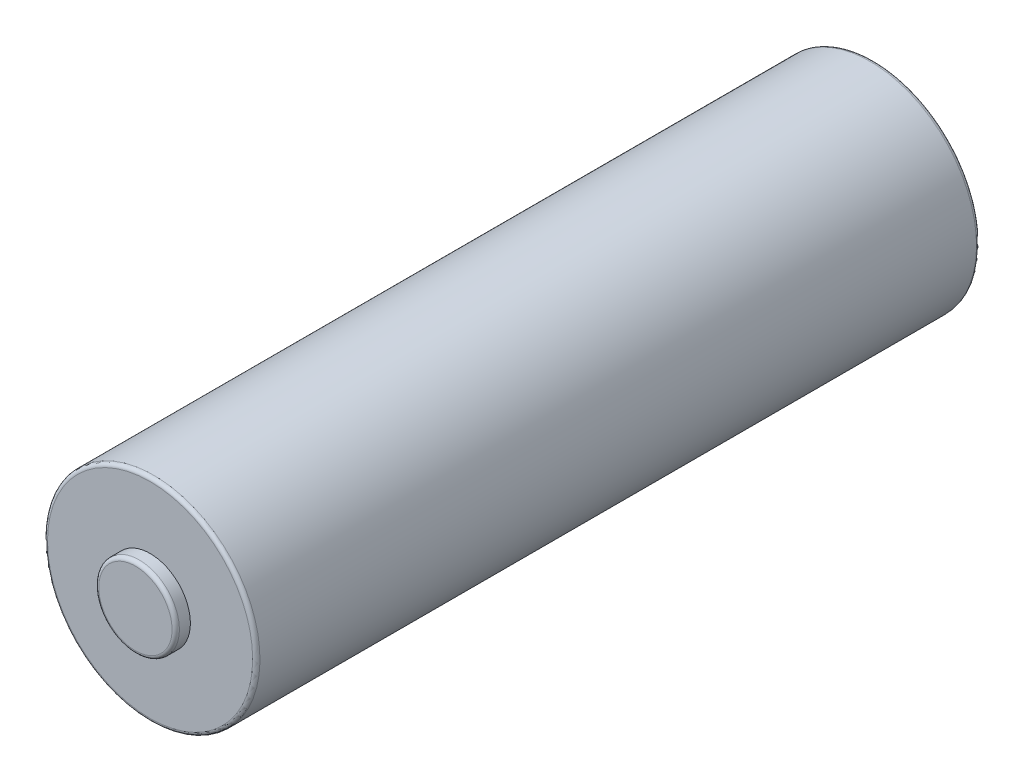
ISO-10303-21;
HEADER;
FILE_DESCRIPTION(('STEP AP214'),'2;1');
FILE_NAME('part.step','',(''),(''),'','','');
FILE_SCHEMA(('AUTOMOTIVE_DESIGN { 1 0 10303 214 1 1 1 1 }'));
ENDSEC;
DATA;
#1=APPLICATION_CONTEXT('core data for automotive mechanical design processes');
#2=APPLICATION_PROTOCOL_DEFINITION('international standard','automotive_design',2000,#1);
#3=PRODUCT_CONTEXT('',#1,'mechanical');
#4=PRODUCT('Part','Part','',(#3));
#5=PRODUCT_RELATED_PRODUCT_CATEGORY('part','',(#4));
#6=PRODUCT_DEFINITION_FORMATION('','',#4);
#7=PRODUCT_DEFINITION_CONTEXT('part definition',#1,'design');
#8=PRODUCT_DEFINITION('design','',#6,#7);
#9=PRODUCT_DEFINITION_SHAPE('','',#8);
#10=(LENGTH_UNIT() NAMED_UNIT(*) SI_UNIT(.MILLI.,.METRE.));
#11=(NAMED_UNIT(*) PLANE_ANGLE_UNIT() SI_UNIT($,.RADIAN.));
#12=(NAMED_UNIT(*) SI_UNIT($,.STERADIAN.) SOLID_ANGLE_UNIT());
#13=UNCERTAINTY_MEASURE_WITH_UNIT(LENGTH_MEASURE(1.E-05),#10,'distance_accuracy_value','');
#14=(GEOMETRIC_REPRESENTATION_CONTEXT(3) GLOBAL_UNCERTAINTY_ASSIGNED_CONTEXT((#13)) GLOBAL_UNIT_ASSIGNED_CONTEXT((#10,
#11,#12)) REPRESENTATION_CONTEXT('',''));
#15=CARTESIAN_POINT('',(0.,0.,0.));
#16=DIRECTION('',(0.,0.,1.));
#17=DIRECTION('',(1.,0.,0.));
#18=AXIS2_PLACEMENT_3D('',#15,#16,#17);
#19=CARTESIAN_POINT('',(0.,0.,42.153036437247));
#20=DIRECTION('',(0.,0.,-1.));
#21=DIRECTION('',(-1.,0.,0.));
#22=AXIS2_PLACEMENT_3D('',#19,#20,#21);
#23=CYLINDRICAL_SURFACE('',#22,4.25101214574899);
#24=CARTESIAN_POINT('',(0.,0.,42.085020242915));
#25=DIRECTION('',(0.,0.,-1.));
#26=DIRECTION('',(-1.,0.,0.));
#27=AXIS2_PLACEMENT_3D('',#24,#25,#26);
#28=CIRCLE('',#27,4.25101214574899);
#29=CARTESIAN_POINT('',(-4.25101214574899,0.,42.085020242915));
#30=VERTEX_POINT('',#29);
#31=EDGE_CURVE('P0_E10',#30,#30,#28,.T.);
#32=ORIENTED_EDGE('',*,*,#31,.T.);
#33=EDGE_LOOP('',(#32));
#34=FACE_BOUND('',#33,.T.);
#35=CARTESIAN_POINT('',(0.,0.,42.153036437247));
#36=DIRECTION('',(0.,0.,-1.));
#37=DIRECTION('',(-1.,0.,0.));
#38=AXIS2_PLACEMENT_3D('',#35,#36,#37);
#39=CIRCLE('',#38,4.25101214574899);
#40=CARTESIAN_POINT('',(-4.25101214574899,0.,42.153036437247));
#41=VERTEX_POINT('',#40);
#42=EDGE_CURVE('P0_E81',#41,#41,#39,.T.);
#43=ORIENTED_EDGE('',*,*,#42,.F.);
#44=EDGE_LOOP('',(#43));
#45=FACE_BOUND('',#44,.T.);
#46=ADVANCED_FACE('P0_F47',(#34,#45),#23,.F.);
#47=CARTESIAN_POINT('',(4.25101214574899,0.,42.085020242915));
#48=DIRECTION('',(0.,0.,-1.));
#49=DIRECTION('',(-1.,0.,0.));
#50=AXIS2_PLACEMENT_3D('',#47,#48,#49);
#51=PLANE('',#50);
#52=CARTESIAN_POINT('',(0.,0.,42.085020242915));
#53=DIRECTION('',(0.,0.,-1.));
#54=DIRECTION('',(-1.,0.,0.));
#55=AXIS2_PLACEMENT_3D('',#52,#53,#54);
#56=CIRCLE('',#55,6.16396761133603);
#57=CARTESIAN_POINT('',(-6.16396761133603,0.,42.085020242915));
#58=VERTEX_POINT('',#57);
#59=EDGE_CURVE('P0_E53',#58,#58,#56,.T.);
#60=ORIENTED_EDGE('',*,*,#59,.T.);
#61=EDGE_LOOP('',(#60));
#62=FACE_BOUND('',#61,.T.);
#63=ORIENTED_EDGE('',*,*,#31,.F.);
#64=EDGE_LOOP('',(#63));
#65=FACE_BOUND('',#64,.T.);
#66=ADVANCED_FACE('P0_F89',(#62,#65),#51,.T.);
#67=CARTESIAN_POINT('',(0.,0.,42.153036437247));
#68=DIRECTION('',(0.,0.,-1.));
#69=DIRECTION('',(-1.,0.,0.));
#70=AXIS2_PLACEMENT_3D('',#67,#68,#69);
#71=CYLINDRICAL_SURFACE('',#70,6.16396761133603);
#72=CARTESIAN_POINT('',(0.,0.,0.085020242914978));
#73=DIRECTION('',(0.,0.,-1.));
#74=DIRECTION('',(-1.,0.,0.));
#75=AXIS2_PLACEMENT_3D('',#72,#73,#74);
#76=CIRCLE('',#75,6.16396761133603);
#77=CARTESIAN_POINT('',(-6.16396761133603,0.,0.085020242914978));
#78=VERTEX_POINT('',#77);
#79=EDGE_CURVE('P0_E57',#78,#78,#76,.T.);
#80=ORIENTED_EDGE('',*,*,#79,.T.);
#81=EDGE_LOOP('',(#80));
#82=FACE_BOUND('',#81,.T.);
#83=ORIENTED_EDGE('',*,*,#59,.F.);
#84=EDGE_LOOP('',(#83));
#85=FACE_BOUND('',#84,.T.);
#86=ADVANCED_FACE('P0_F93',(#82,#85),#71,.F.);
#87=CARTESIAN_POINT('',(6.16396761133603,0.,0.0850202429149802));
#88=DIRECTION('',(0.,0.,1.));
#89=DIRECTION('',(1.,0.,0.));
#90=AXIS2_PLACEMENT_3D('',#87,#88,#89);
#91=PLANE('',#90);
#92=CARTESIAN_POINT('',(0.,0.,0.085020242914978));
#93=DIRECTION('',(0.,0.,-1.));
#94=DIRECTION('',(-1.,0.,0.));
#95=AXIS2_PLACEMENT_3D('',#92,#93,#94);
#96=CIRCLE('',#95,4.25101214574899);
#97=CARTESIAN_POINT('',(-4.25101214574899,0.,0.085020242914978));
#98=VERTEX_POINT('',#97);
#99=EDGE_CURVE('P0_E61',#98,#98,#96,.T.);
#100=ORIENTED_EDGE('',*,*,#99,.T.);
#101=EDGE_LOOP('',(#100));
#102=FACE_BOUND('',#101,.T.);
#103=ORIENTED_EDGE('',*,*,#79,.F.);
#104=EDGE_LOOP('',(#103));
#105=FACE_BOUND('',#104,.T.);
#106=ADVANCED_FACE('P0_F97',(#102,#105),#91,.T.);
#107=CARTESIAN_POINT('',(0.,0.,42.153036437247));
#108=DIRECTION('',(0.,0.,-1.));
#109=DIRECTION('',(-1.,0.,0.));
#110=AXIS2_PLACEMENT_3D('',#107,#108,#109);
#111=CYLINDRICAL_SURFACE('',#110,4.25101214574899);
#112=CARTESIAN_POINT('',(0.,0.,0.0170040485829928));
#113=DIRECTION('',(0.,0.,-1.));
#114=DIRECTION('',(-1.,0.,0.));
#115=AXIS2_PLACEMENT_3D('',#112,#113,#114);
#116=CIRCLE('',#115,4.25101214574899);
#117=CARTESIAN_POINT('',(-4.25101214574899,0.,0.0170040485829928));
#118=VERTEX_POINT('',#117);
#119=EDGE_CURVE('P0_E66',#118,#118,#116,.T.);
#120=ORIENTED_EDGE('',*,*,#119,.T.);
#121=EDGE_LOOP('',(#120));
#122=FACE_BOUND('',#121,.T.);
#123=ORIENTED_EDGE('',*,*,#99,.F.);
#124=EDGE_LOOP('',(#123));
#125=FACE_BOUND('',#124,.T.);
#126=ADVANCED_FACE('P0_F104',(#122,#125),#111,.F.);
#127=CARTESIAN_POINT('',(4.25101214574899,0.,0.017004048582996));
#128=DIRECTION('',(0.,0.,-1.));
#129=DIRECTION('',(-1.,0.,0.));
#130=AXIS2_PLACEMENT_3D('',#127,#128,#129);
#131=PLANE('',#130);
#132=CARTESIAN_POINT('',(0.,0.,0.0170040485829928));
#133=DIRECTION('',(0.,0.,-1.));
#134=DIRECTION('',(-1.,0.,0.));
#135=AXIS2_PLACEMENT_3D('',#132,#133,#134);
#136=CIRCLE('',#135,6.06194331983806);
#137=CARTESIAN_POINT('',(-6.06194331983806,0.,0.0170040485829928));
#138=VERTEX_POINT('',#137);
#139=EDGE_CURVE('P0_E69',#138,#138,#136,.T.);
#140=ORIENTED_EDGE('',*,*,#139,.T.);
#141=EDGE_LOOP('',(#140));
#142=FACE_BOUND('',#141,.T.);
#143=ORIENTED_EDGE('',*,*,#119,.F.);
#144=EDGE_LOOP('',(#143));
#145=FACE_BOUND('',#144,.T.);
#146=ADVANCED_FACE('P0_F108',(#142,#145),#131,.T.);
#147=CARTESIAN_POINT('',(0.,0.,0.187044534412955));
#148=DIRECTION('',(0.,0.,-1.));
#149=DIRECTION('',(-1.,0.,0.));
#150=AXIS2_PLACEMENT_3D('',#147,#148,#149);
#151=TOROIDAL_SURFACE('',#150,6.06194331983806,0.170040485829959);
#152=CARTESIAN_POINT('',(0.,0.,0.187044534412956));
#153=DIRECTION('',(0.,0.,-1.));
#154=DIRECTION('',(-1.,0.,0.));
#155=AXIS2_PLACEMENT_3D('',#152,#153,#154);
#156=CIRCLE('',#155,6.23198380566802);
#157=CARTESIAN_POINT('',(-6.23198380566802,0.,0.187044534412956));
#158=VERTEX_POINT('',#157);
#159=EDGE_CURVE('P0_E72',#158,#158,#156,.T.);
#160=ORIENTED_EDGE('',*,*,#159,.T.);
#161=EDGE_LOOP('',(#160));
#162=FACE_BOUND('',#161,.T.);
#163=ORIENTED_EDGE('',*,*,#139,.F.);
#164=EDGE_LOOP('',(#163));
#165=FACE_BOUND('',#164,.T.);
#166=ADVANCED_FACE('P0_F112',(#162,#165),#151,.T.);
#167=CARTESIAN_POINT('',(0.,0.,42.153036437247));
#168=DIRECTION('',(0.,0.,-1.));
#169=DIRECTION('',(-1.,0.,0.));
#170=AXIS2_PLACEMENT_3D('',#167,#168,#169);
#171=CYLINDRICAL_SURFACE('',#170,6.23198380566802);
#172=CARTESIAN_POINT('',(0.,0.,41.982995951417));
#173=DIRECTION('',(0.,0.,-1.));
#174=DIRECTION('',(-1.,0.,0.));
#175=AXIS2_PLACEMENT_3D('',#172,#173,#174);
#176=CIRCLE('',#175,6.23198380566802);
#177=CARTESIAN_POINT('',(-6.23198380566802,0.,41.982995951417));
#178=VERTEX_POINT('',#177);
#179=EDGE_CURVE('P0_E75',#178,#178,#176,.T.);
#180=ORIENTED_EDGE('',*,*,#179,.T.);
#181=EDGE_LOOP('',(#180));
#182=FACE_BOUND('',#181,.T.);
#183=ORIENTED_EDGE('',*,*,#159,.F.);
#184=EDGE_LOOP('',(#183));
#185=FACE_BOUND('',#184,.T.);
#186=ADVANCED_FACE('P0_F116',(#182,#185),#171,.T.);
#187=CARTESIAN_POINT('',(0.,0.,41.982995951417));
#188=DIRECTION('',(0.,0.,-1.));
#189=DIRECTION('',(-1.,0.,0.));
#190=AXIS2_PLACEMENT_3D('',#187,#188,#189);
#191=TOROIDAL_SURFACE('',#190,6.06194331983806,0.170040485829961);
#192=CARTESIAN_POINT('',(0.,0.,42.153036437247));
#193=DIRECTION('',(0.,0.,-1.));
#194=DIRECTION('',(-1.,0.,0.));
#195=AXIS2_PLACEMENT_3D('',#192,#193,#194);
#196=CIRCLE('',#195,6.06194331983806);
#197=CARTESIAN_POINT('',(-6.06194331983806,0.,42.153036437247));
#198=VERTEX_POINT('',#197);
#199=EDGE_CURVE('P0_E78',#198,#198,#196,.T.);
#200=ORIENTED_EDGE('',*,*,#199,.T.);
#201=EDGE_LOOP('',(#200));
#202=FACE_BOUND('',#201,.T.);
#203=ORIENTED_EDGE('',*,*,#179,.F.);
#204=EDGE_LOOP('',(#203));
#205=FACE_BOUND('',#204,.T.);
#206=ADVANCED_FACE('P0_F120',(#202,#205),#191,.T.);
#207=CARTESIAN_POINT('',(6.06194331983806,0.,42.153036437247));
#208=DIRECTION('',(0.,0.,1.));
#209=DIRECTION('',(1.,0.,0.));
#210=AXIS2_PLACEMENT_3D('',#207,#208,#209);
#211=PLANE('',#210);
#212=ORIENTED_EDGE('',*,*,#42,.T.);
#213=EDGE_LOOP('',(#212));
#214=FACE_BOUND('',#213,.T.);
#215=ORIENTED_EDGE('',*,*,#199,.F.);
#216=EDGE_LOOP('',(#215));
#217=FACE_BOUND('',#216,.T.);
#218=ADVANCED_FACE('P0_F85',(#214,#217),#211,.T.);
#219=CLOSED_SHELL('',(#46,#66,#86,#106,#126,#146,#166,#186,#206,#218));
#220=MANIFOLD_SOLID_BREP('P0_B2',#219);
#221=CARTESIAN_POINT('',(0.,0.,50.5));
#222=DIRECTION('',(0.,0.,-1.));
#223=DIRECTION('',(0.,-1.,0.));
#224=AXIS2_PLACEMENT_3D('',#221,#222,#223);
#225=PLANE('',#224);
#226=CARTESIAN_POINT('',(0.,0.,50.5));
#227=DIRECTION('',(0.,0.,1.));
#228=DIRECTION('',(0.,-1.,0.));
#229=AXIS2_PLACEMENT_3D('',#226,#227,#228);
#230=CIRCLE('',#229,2.5);
#231=CARTESIAN_POINT('',(0.,-2.5,50.5));
#232=VERTEX_POINT('',#231);
#233=EDGE_CURVE('P1_E11',#232,#232,#230,.T.);
#234=ORIENTED_EDGE('',*,*,#233,.T.);
#235=EDGE_LOOP('',(#234));
#236=FACE_BOUND('',#235,.T.);
#237=ADVANCED_FACE('P1_F19',(#236),#225,.F.);
#238=CARTESIAN_POINT('',(0.,3.,0.));
#239=DIRECTION('',(0.,0.,1.));
#240=DIRECTION('',(1.,0.,0.));
#241=AXIS2_PLACEMENT_3D('',#238,#239,#240);
#242=PLANE('',#241);
#243=CARTESIAN_POINT('',(0.,0.,0.));
#244=DIRECTION('',(0.,0.,1.));
#245=DIRECTION('',(0.,-1.,0.));
#246=AXIS2_PLACEMENT_3D('',#243,#244,#245);
#247=CIRCLE('',#246,3.);
#248=CARTESIAN_POINT('',(0.,-3.,0.));
#249=VERTEX_POINT('',#248);
#250=EDGE_CURVE('P1_E78',#249,#249,#247,.T.);
#251=ORIENTED_EDGE('',*,*,#250,.F.);
#252=EDGE_LOOP('',(#251));
#253=FACE_BOUND('',#252,.T.);
#254=ADVANCED_FACE('P1_F21',(#253),#242,.F.);
#255=CARTESIAN_POINT('',(0.,2.75,49.5));
#256=DIRECTION('',(0.,0.,-1.));
#257=DIRECTION('',(0.,-1.,0.));
#258=AXIS2_PLACEMENT_3D('',#255,#256,#257);
#259=PLANE('',#258);
#260=CARTESIAN_POINT('',(0.,0.,49.5));
#261=DIRECTION('',(0.,0.,1.));
#262=DIRECTION('',(0.,-1.,0.));
#263=AXIS2_PLACEMENT_3D('',#260,#261,#262);
#264=CIRCLE('',#263,2.75);
#265=CARTESIAN_POINT('',(0.,-2.75,49.5));
#266=VERTEX_POINT('',#265);
#267=EDGE_CURVE('P1_E115',#266,#266,#264,.T.);
#268=ORIENTED_EDGE('',*,*,#267,.F.);
#269=EDGE_LOOP('',(#268));
#270=FACE_BOUND('',#269,.T.);
#271=CARTESIAN_POINT('',(0.,0.,49.5));
#272=DIRECTION('',(0.,0.,1.));
#273=DIRECTION('',(0.,-1.,0.));
#274=AXIS2_PLACEMENT_3D('',#271,#272,#273);
#275=CIRCLE('',#274,7.);
#276=CARTESIAN_POINT('',(0.,-7.,49.5));
#277=VERTEX_POINT('',#276);
#278=EDGE_CURVE('P1_E104',#277,#277,#275,.T.);
#279=ORIENTED_EDGE('',*,*,#278,.T.);
#280=EDGE_LOOP('',(#279));
#281=FACE_BOUND('',#280,.T.);
#282=ADVANCED_FACE('P1_F149',(#270,#281),#259,.F.);
#283=CARTESIAN_POINT('',(0.,7.,0.1));
#284=DIRECTION('',(0.,0.,1.));
#285=DIRECTION('',(1.,0.,0.));
#286=AXIS2_PLACEMENT_3D('',#283,#284,#285);
#287=PLANE('',#286);
#288=CARTESIAN_POINT('',(0.,0.,0.1));
#289=DIRECTION('',(0.,0.,1.));
#290=DIRECTION('',(0.,-1.,0.));
#291=AXIS2_PLACEMENT_3D('',#288,#289,#290);
#292=CIRCLE('',#291,3.5);
#293=CARTESIAN_POINT('',(0.,-3.5,0.1));
#294=VERTEX_POINT('',#293);
#295=EDGE_CURVE('P1_E70',#294,#294,#292,.T.);
#296=ORIENTED_EDGE('',*,*,#295,.T.);
#297=EDGE_LOOP('',(#296));
#298=FACE_BOUND('',#297,.T.);
#299=CARTESIAN_POINT('',(0.,0.,0.1));
#300=DIRECTION('',(0.,0.,1.));
#301=DIRECTION('',(0.,-1.,0.));
#302=AXIS2_PLACEMENT_3D('',#299,#300,#301);
#303=CIRCLE('',#302,7.);
#304=CARTESIAN_POINT('',(0.,-7.,0.1));
#305=VERTEX_POINT('',#304);
#306=EDGE_CURVE('P1_E85',#305,#305,#303,.T.);
#307=ORIENTED_EDGE('',*,*,#306,.F.);
#308=EDGE_LOOP('',(#307));
#309=FACE_BOUND('',#308,.T.);
#310=ADVANCED_FACE('P1_F71',(#298,#309),#287,.F.);
#311=CARTESIAN_POINT('',(0.,0.,50.25));
#312=DIRECTION('',(0.,0.,1.));
#313=DIRECTION('',(0.,-1.,0.));
#314=AXIS2_PLACEMENT_3D('',#311,#312,#313);
#315=TOROIDAL_SURFACE('',#314,2.5,0.25);
#316=CARTESIAN_POINT('',(0.,-2.5,50.25));
#317=DIRECTION('',(1.,0.,0.));
#318=DIRECTION('',(0.,-1.,0.));
#319=AXIS2_PLACEMENT_3D('',#316,#317,#318);
#320=CIRCLE('',#319,0.25);
#321=CARTESIAN_POINT('',(0.,-2.75,50.25));
#322=VERTEX_POINT('',#321);
#323=EDGE_CURVE('P1_E30',#232,#322,#320,.T.);
#324=ORIENTED_EDGE('',*,*,#323,.T.);
#325=CARTESIAN_POINT('',(0.,0.,50.25));
#326=DIRECTION('',(0.,0.,1.));
#327=DIRECTION('',(0.,-1.,0.));
#328=AXIS2_PLACEMENT_3D('',#325,#326,#327);
#329=CIRCLE('',#328,2.75);
#330=EDGE_CURVE('P1_E183',#322,#322,#329,.T.);
#331=ORIENTED_EDGE('',*,*,#330,.T.);
#332=ORIENTED_EDGE('',*,*,#323,.F.);
#333=ORIENTED_EDGE('',*,*,#233,.F.);
#334=EDGE_LOOP('',(#324,#331,#332,#333));
#335=FACE_BOUND('',#334,.T.);
#336=ADVANCED_FACE('P1_F148',(#335),#315,.T.);
#337=CARTESIAN_POINT('',(0.,0.,0.));
#338=DIRECTION('',(0.,0.,1.));
#339=DIRECTION('',(0.,-1.,0.));
#340=AXIS2_PLACEMENT_3D('',#337,#338,#339);
#341=CYLINDRICAL_SURFACE('',#340,2.75);
#342=DIRECTION('',(0.,0.,-1.));
#343=VECTOR('',#342,1.);
#344=CARTESIAN_POINT('',(0.,-2.75,50.25));
#345=LINE('',#344,#343);
#346=EDGE_CURVE('P1_E109',#322,#266,#345,.T.);
#347=ORIENTED_EDGE('',*,*,#346,.T.);
#348=ORIENTED_EDGE('',*,*,#267,.T.);
#349=ORIENTED_EDGE('',*,*,#346,.F.);
#350=ORIENTED_EDGE('',*,*,#330,.F.);
#351=EDGE_LOOP('',(#347,#348,#349,#350));
#352=FACE_BOUND('',#351,.T.);
#353=ADVANCED_FACE('P1_F154',(#352),#341,.T.);
#354=CARTESIAN_POINT('',(0.,0.,49.25));
#355=DIRECTION('',(0.,0.,1.));
#356=DIRECTION('',(0.,-1.,0.));
#357=AXIS2_PLACEMENT_3D('',#354,#355,#356);
#358=TOROIDAL_SURFACE('',#357,7.,0.25);
#359=CARTESIAN_POINT('',(0.,-7.,49.25));
#360=DIRECTION('',(1.,0.,0.));
#361=DIRECTION('',(0.,-1.,0.));
#362=AXIS2_PLACEMENT_3D('',#359,#360,#361);
#363=CIRCLE('',#362,0.25);
#364=CARTESIAN_POINT('',(0.,-7.25,49.25));
#365=VERTEX_POINT('',#364);
#366=EDGE_CURVE('P1_E91',#277,#365,#363,.T.);
#367=ORIENTED_EDGE('',*,*,#366,.T.);
#368=CARTESIAN_POINT('',(0.,0.,49.25));
#369=DIRECTION('',(0.,0.,1.));
#370=DIRECTION('',(0.,-1.,0.));
#371=AXIS2_PLACEMENT_3D('',#368,#369,#370);
#372=CIRCLE('',#371,7.25);
#373=EDGE_CURVE('P1_E126',#365,#365,#372,.T.);
#374=ORIENTED_EDGE('',*,*,#373,.T.);
#375=ORIENTED_EDGE('',*,*,#366,.F.);
#376=ORIENTED_EDGE('',*,*,#278,.F.);
#377=EDGE_LOOP('',(#367,#374,#375,#376));
#378=FACE_BOUND('',#377,.T.);
#379=ADVANCED_FACE('P1_F172',(#378),#358,.T.);
#380=CARTESIAN_POINT('',(0.,0.,0.));
#381=DIRECTION('',(0.,0.,1.));
#382=DIRECTION('',(0.,-1.,0.));
#383=AXIS2_PLACEMENT_3D('',#380,#381,#382);
#384=CYLINDRICAL_SURFACE('',#383,7.25);
#385=DIRECTION('',(0.,0.,-1.));
#386=VECTOR('',#385,1.);
#387=CARTESIAN_POINT('',(0.,-7.25,49.25));
#388=LINE('',#387,#386);
#389=CARTESIAN_POINT('',(0.,-7.25,0.35));
#390=VERTEX_POINT('',#389);
#391=EDGE_CURVE('P1_E110',#365,#390,#388,.T.);
#392=ORIENTED_EDGE('',*,*,#391,.T.);
#393=CARTESIAN_POINT('',(0.,0.,0.35));
#394=DIRECTION('',(0.,0.,1.));
#395=DIRECTION('',(0.,-1.,0.));
#396=AXIS2_PLACEMENT_3D('',#393,#394,#395);
#397=CIRCLE('',#396,7.25);
#398=EDGE_CURVE('P1_E132',#390,#390,#397,.T.);
#399=ORIENTED_EDGE('',*,*,#398,.T.);
#400=ORIENTED_EDGE('',*,*,#391,.F.);
#401=ORIENTED_EDGE('',*,*,#373,.F.);
#402=EDGE_LOOP('',(#392,#399,#400,#401));
#403=FACE_BOUND('',#402,.T.);
#404=ADVANCED_FACE('P1_F170',(#403),#384,.T.);
#405=CARTESIAN_POINT('',(0.,0.,0.35));
#406=DIRECTION('',(0.,0.,1.));
#407=DIRECTION('',(0.,-1.,0.));
#408=AXIS2_PLACEMENT_3D('',#405,#406,#407);
#409=TOROIDAL_SURFACE('',#408,7.,0.25);
#410=CARTESIAN_POINT('',(0.,-7.,0.35));
#411=DIRECTION('',(1.,0.,0.));
#412=DIRECTION('',(0.,-1.,0.));
#413=AXIS2_PLACEMENT_3D('',#410,#411,#412);
#414=CIRCLE('',#413,0.25);
#415=EDGE_CURVE('P1_E77',#390,#305,#414,.T.);
#416=ORIENTED_EDGE('',*,*,#415,.T.);
#417=ORIENTED_EDGE('',*,*,#306,.T.);
#418=ORIENTED_EDGE('',*,*,#415,.F.);
#419=ORIENTED_EDGE('',*,*,#398,.F.);
#420=EDGE_LOOP('',(#416,#417,#418,#419));
#421=FACE_BOUND('',#420,.T.);
#422=ADVANCED_FACE('P1_F146',(#421),#409,.T.);
#423=CARTESIAN_POINT('',(0.,0.,0.));
#424=DIRECTION('',(0.,0.,1.));
#425=DIRECTION('',(0.,-1.,0.));
#426=AXIS2_PLACEMENT_3D('',#423,#424,#425);
#427=CONICAL_SURFACE('',#426,3.,1.37340076537603);
#428=DIRECTION('',(0.,0.980580675729382,-0.196116134945876));
#429=VECTOR('',#428,1.);
#430=CARTESIAN_POINT('',(0.,-3.5,0.1));
#431=LINE('',#430,#429);
#432=EDGE_CURVE('P1_E86',#294,#249,#431,.T.);
#433=ORIENTED_EDGE('',*,*,#432,.T.);
#434=ORIENTED_EDGE('',*,*,#250,.T.);
#435=ORIENTED_EDGE('',*,*,#432,.F.);
#436=ORIENTED_EDGE('',*,*,#295,.F.);
#437=EDGE_LOOP('',(#433,#434,#435,#436));
#438=FACE_BOUND('',#437,.T.);
#439=ADVANCED_FACE('P1_F167',(#438),#427,.T.);
#440=CLOSED_SHELL('',(#237,#254,#282,#310,#336,#353,#379,#404,#422,#439));
#441=MANIFOLD_SOLID_BREP('P1_B1',#440);
#442=ADVANCED_BREP_SHAPE_REPRESENTATION('',(#18,#220,#441),#14);
#443=SHAPE_DEFINITION_REPRESENTATION(#9,#442);
ENDSEC;
END-ISO-10303-21;
